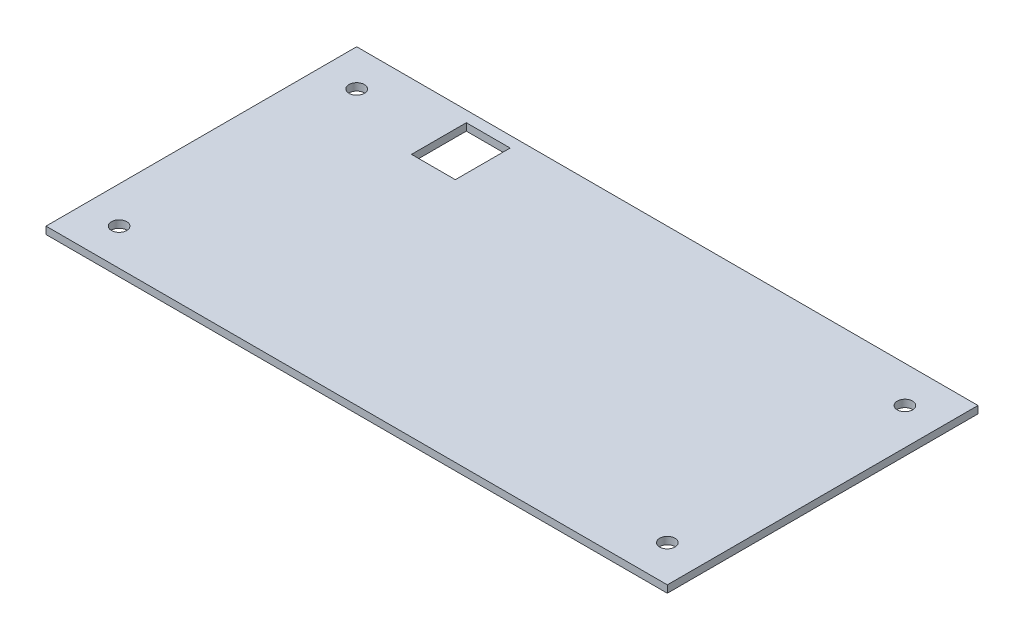
ISO-10303-21;
HEADER;
FILE_DESCRIPTION(('STEP AP214'),'2;1');
FILE_NAME('part.step','',(''),(''),'','','');
FILE_SCHEMA(('AUTOMOTIVE_DESIGN { 1 0 10303 214 1 1 1 1 }'));
ENDSEC;
DATA;
#1=APPLICATION_CONTEXT('core data for automotive mechanical design processes');
#2=APPLICATION_PROTOCOL_DEFINITION('international standard','automotive_design',2000,#1);
#3=PRODUCT_CONTEXT('',#1,'mechanical');
#4=PRODUCT('Part','Part','',(#3));
#5=PRODUCT_RELATED_PRODUCT_CATEGORY('part','',(#4));
#6=PRODUCT_DEFINITION_FORMATION('','',#4);
#7=PRODUCT_DEFINITION_CONTEXT('part definition',#1,'design');
#8=PRODUCT_DEFINITION('design','',#6,#7);
#9=PRODUCT_DEFINITION_SHAPE('','',#8);
#10=(LENGTH_UNIT() NAMED_UNIT(*) SI_UNIT(.MILLI.,.METRE.));
#11=(NAMED_UNIT(*) PLANE_ANGLE_UNIT() SI_UNIT($,.RADIAN.));
#12=(NAMED_UNIT(*) SI_UNIT($,.STERADIAN.) SOLID_ANGLE_UNIT());
#13=UNCERTAINTY_MEASURE_WITH_UNIT(LENGTH_MEASURE(1.E-05),#10,'distance_accuracy_value','');
#14=(GEOMETRIC_REPRESENTATION_CONTEXT(3) GLOBAL_UNCERTAINTY_ASSIGNED_CONTEXT((#13)) GLOBAL_UNIT_ASSIGNED_CONTEXT((#10,
#11,#12)) REPRESENTATION_CONTEXT('',''));
#15=CARTESIAN_POINT('',(0.,0.,0.));
#16=DIRECTION('',(0.,0.,1.));
#17=DIRECTION('',(1.,0.,0.));
#18=AXIS2_PLACEMENT_3D('',#15,#16,#17);
#19=CARTESIAN_POINT('',(-74.5991561181434,2.,-39.4514767932489));
#20=DIRECTION('',(1.,0.,0.));
#21=DIRECTION('',(0.,0.,-1.));
#22=AXIS2_PLACEMENT_3D('',#19,#20,#21);
#23=PLANE('',#22);
#24=DIRECTION('',(0.,0.,1.));
#25=VECTOR('',#24,1.);
#26=CARTESIAN_POINT('',(-74.5991561181434,0.,-39.4514767932489));
#27=LINE('',#26,#25);
#28=CARTESIAN_POINT('',(-74.5991561181434,0.,-39.4514767932489));
#29=VERTEX_POINT('',#28);
#30=CARTESIAN_POINT('',(-74.5991561181434,0.,45.5485232067511));
#31=VERTEX_POINT('',#30);
#32=EDGE_CURVE('E136',#29,#31,#27,.T.);
#33=ORIENTED_EDGE('',*,*,#32,.T.);
#34=DIRECTION('',(0.,-1.,0.));
#35=VECTOR('',#34,1.);
#36=CARTESIAN_POINT('',(-74.5991561181434,2.,45.5485232067511));
#37=LINE('',#36,#35);
#38=CARTESIAN_POINT('',(-74.5991561181434,2.,45.5485232067511));
#39=VERTEX_POINT('',#38);
#40=EDGE_CURVE('E11',#39,#31,#37,.T.);
#41=ORIENTED_EDGE('',*,*,#40,.F.);
#42=DIRECTION('',(0.,0.,1.));
#43=VECTOR('',#42,1.);
#44=CARTESIAN_POINT('',(-74.5991561181434,2.,-39.4514767932489));
#45=LINE('',#44,#43);
#46=CARTESIAN_POINT('',(-74.5991561181434,2.,-39.4514767932489));
#47=VERTEX_POINT('',#46);
#48=EDGE_CURVE('E145',#47,#39,#45,.T.);
#49=ORIENTED_EDGE('',*,*,#48,.F.);
#50=DIRECTION('',(0.,-1.,0.));
#51=VECTOR('',#50,1.);
#52=CARTESIAN_POINT('',(-74.5991561181434,2.,-39.4514767932489));
#53=LINE('',#52,#51);
#54=EDGE_CURVE('E152',#47,#29,#53,.T.);
#55=ORIENTED_EDGE('',*,*,#54,.T.);
#56=EDGE_LOOP('',(#33,#41,#49,#55));
#57=FACE_BOUND('',#56,.T.);
#58=ADVANCED_FACE('F39',(#57),#23,.F.);
#59=CARTESIAN_POINT('',(-74.5991561181434,2.,45.5485232067511));
#60=DIRECTION('',(0.,0.,-1.));
#61=DIRECTION('',(-1.,0.,0.));
#62=AXIS2_PLACEMENT_3D('',#59,#60,#61);
#63=PLANE('',#62);
#64=DIRECTION('',(1.,0.,0.));
#65=VECTOR('',#64,1.);
#66=CARTESIAN_POINT('',(-74.5991561181434,0.,45.5485232067511));
#67=LINE('',#66,#65);
#68=CARTESIAN_POINT('',(95.4008438818566,0.,45.5485232067511));
#69=VERTEX_POINT('',#68);
#70=EDGE_CURVE('E160',#31,#69,#67,.T.);
#71=ORIENTED_EDGE('',*,*,#70,.T.);
#72=DIRECTION('',(0.,-1.,0.));
#73=VECTOR('',#72,1.);
#74=CARTESIAN_POINT('',(95.4008438818566,2.,45.5485232067511));
#75=LINE('',#74,#73);
#76=CARTESIAN_POINT('',(95.4008438818566,2.,45.5485232067511));
#77=VERTEX_POINT('',#76);
#78=EDGE_CURVE('E46',#77,#69,#75,.T.);
#79=ORIENTED_EDGE('',*,*,#78,.F.);
#80=DIRECTION('',(1.,0.,0.));
#81=VECTOR('',#80,1.);
#82=CARTESIAN_POINT('',(-74.5991561181434,2.,45.5485232067511));
#83=LINE('',#82,#81);
#84=EDGE_CURVE('E150',#39,#77,#83,.T.);
#85=ORIENTED_EDGE('',*,*,#84,.F.);
#86=ORIENTED_EDGE('',*,*,#40,.T.);
#87=EDGE_LOOP('',(#71,#79,#85,#86));
#88=FACE_BOUND('',#87,.T.);
#89=ADVANCED_FACE('F183',(#88),#63,.F.);
#90=CARTESIAN_POINT('',(95.4008438818566,2.,-39.4514767932489));
#91=DIRECTION('',(-1.,0.,0.));
#92=DIRECTION('',(0.,0.,1.));
#93=AXIS2_PLACEMENT_3D('',#90,#91,#92);
#94=PLANE('',#93);
#95=DIRECTION('',(0.,0.,-1.));
#96=VECTOR('',#95,1.);
#97=CARTESIAN_POINT('',(95.4008438818566,0.,-39.4514767932489));
#98=LINE('',#97,#96);
#99=CARTESIAN_POINT('',(95.4008438818566,0.,-39.4514767932489));
#100=VERTEX_POINT('',#99);
#101=EDGE_CURVE('E157',#69,#100,#98,.T.);
#102=ORIENTED_EDGE('',*,*,#101,.T.);
#103=DIRECTION('',(0.,-1.,0.));
#104=VECTOR('',#103,1.);
#105=CARTESIAN_POINT('',(95.4008438818566,2.,-39.4514767932489));
#106=LINE('',#105,#104);
#107=CARTESIAN_POINT('',(95.4008438818566,2.,-39.4514767932489));
#108=VERTEX_POINT('',#107);
#109=EDGE_CURVE('E163',#108,#100,#106,.T.);
#110=ORIENTED_EDGE('',*,*,#109,.F.);
#111=DIRECTION('',(0.,0.,-1.));
#112=VECTOR('',#111,1.);
#113=CARTESIAN_POINT('',(95.4008438818566,2.,-39.4514767932489));
#114=LINE('',#113,#112);
#115=EDGE_CURVE('E147',#77,#108,#114,.T.);
#116=ORIENTED_EDGE('',*,*,#115,.F.);
#117=ORIENTED_EDGE('',*,*,#78,.T.);
#118=EDGE_LOOP('',(#102,#110,#116,#117));
#119=FACE_BOUND('',#118,.T.);
#120=ADVANCED_FACE('F171',(#119),#94,.F.);
#121=CARTESIAN_POINT('',(-74.5991561181434,2.,-39.4514767932489));
#122=DIRECTION('',(0.,0.,1.));
#123=DIRECTION('',(1.,0.,0.));
#124=AXIS2_PLACEMENT_3D('',#121,#122,#123);
#125=PLANE('',#124);
#126=DIRECTION('',(-1.,0.,0.));
#127=VECTOR('',#126,1.);
#128=CARTESIAN_POINT('',(-74.5991561181434,0.,-39.4514767932489));
#129=LINE('',#128,#127);
#130=EDGE_CURVE('E146',#100,#29,#129,.T.);
#131=ORIENTED_EDGE('',*,*,#130,.T.);
#132=ORIENTED_EDGE('',*,*,#54,.F.);
#133=DIRECTION('',(-1.,0.,0.));
#134=VECTOR('',#133,1.);
#135=CARTESIAN_POINT('',(-74.5991561181434,2.,-39.4514767932489));
#136=LINE('',#135,#134);
#137=EDGE_CURVE('E155',#108,#47,#136,.T.);
#138=ORIENTED_EDGE('',*,*,#137,.F.);
#139=ORIENTED_EDGE('',*,*,#109,.T.);
#140=EDGE_LOOP('',(#131,#132,#138,#139));
#141=FACE_BOUND('',#140,.T.);
#142=ADVANCED_FACE('F178',(#141),#125,.F.);
#143=CARTESIAN_POINT('',(0.,2.,0.));
#144=DIRECTION('',(0.,1.,0.));
#145=DIRECTION('',(0.,0.,1.));
#146=AXIS2_PLACEMENT_3D('',#143,#144,#145);
#147=PLANE('',#146);
#148=CARTESIAN_POINT('',(85.4008438818566,2.,-29.4514767932489));
#149=DIRECTION('',(0.,1.,0.));
#150=DIRECTION('',(0.,0.,1.));
#151=AXIS2_PLACEMENT_3D('',#148,#149,#150);
#152=CIRCLE('',#151,2.1);
#153=CARTESIAN_POINT('',(85.4008438818566,2.,-27.3514767932489));
#154=VERTEX_POINT('',#153);
#155=EDGE_CURVE('E243',#154,#154,#152,.T.);
#156=ORIENTED_EDGE('',*,*,#155,.F.);
#157=EDGE_LOOP('',(#156));
#158=FACE_BOUND('',#157,.T.);
#159=CARTESIAN_POINT('',(-64.5991561181434,2.,35.5485232067511));
#160=DIRECTION('',(0.,1.,0.));
#161=DIRECTION('',(0.,0.,1.));
#162=AXIS2_PLACEMENT_3D('',#159,#160,#161);
#163=CIRCLE('',#162,2.1);
#164=CARTESIAN_POINT('',(-64.5991561181434,2.,37.6485232067511));
#165=VERTEX_POINT('',#164);
#166=EDGE_CURVE('E238',#165,#165,#163,.T.);
#167=ORIENTED_EDGE('',*,*,#166,.F.);
#168=EDGE_LOOP('',(#167));
#169=FACE_BOUND('',#168,.T.);
#170=CARTESIAN_POINT('',(85.4008438818566,2.,35.5485232067511));
#171=DIRECTION('',(0.,1.,0.));
#172=DIRECTION('',(0.,0.,1.));
#173=AXIS2_PLACEMENT_3D('',#170,#171,#172);
#174=CIRCLE('',#173,2.1);
#175=CARTESIAN_POINT('',(85.4008438818566,2.,37.6485232067511));
#176=VERTEX_POINT('',#175);
#177=EDGE_CURVE('E231',#176,#176,#174,.T.);
#178=ORIENTED_EDGE('',*,*,#177,.F.);
#179=EDGE_LOOP('',(#178));
#180=FACE_BOUND('',#179,.T.);
#181=CARTESIAN_POINT('',(-64.5991561181435,2.,-29.4514767932489));
#182=DIRECTION('',(0.,1.,0.));
#183=DIRECTION('',(0.,0.,1.));
#184=AXIS2_PLACEMENT_3D('',#181,#182,#183);
#185=CIRCLE('',#184,2.1);
#186=CARTESIAN_POINT('',(-64.5991561181435,2.,-27.3514767932489));
#187=VERTEX_POINT('',#186);
#188=EDGE_CURVE('E130',#187,#187,#185,.T.);
#189=ORIENTED_EDGE('',*,*,#188,.F.);
#190=EDGE_LOOP('',(#189));
#191=FACE_BOUND('',#190,.T.);
#192=DIRECTION('',(-1.,0.,0.));
#193=VECTOR('',#192,1.);
#194=CARTESIAN_POINT('',(-41.5991561181434,2.,-36.4514767932489));
#195=LINE('',#194,#193);
#196=CARTESIAN_POINT('',(-29.5991561181434,2.,-36.4514767932489));
#197=VERTEX_POINT('',#196);
#198=CARTESIAN_POINT('',(-41.5991561181434,2.,-36.4514767932489));
#199=VERTEX_POINT('',#198);
#200=EDGE_CURVE('E52',#197,#199,#195,.T.);
#201=ORIENTED_EDGE('',*,*,#200,.F.);
#202=DIRECTION('',(0.,0.,-1.));
#203=VECTOR('',#202,1.);
#204=CARTESIAN_POINT('',(-29.5991561181434,2.,-36.4514767932489));
#205=LINE('',#204,#203);
#206=CARTESIAN_POINT('',(-29.5991561181434,2.,-21.4514767932489));
#207=VERTEX_POINT('',#206);
#208=EDGE_CURVE('E122',#207,#197,#205,.T.);
#209=ORIENTED_EDGE('',*,*,#208,.F.);
#210=DIRECTION('',(1.,0.,0.));
#211=VECTOR('',#210,1.);
#212=CARTESIAN_POINT('',(-41.5991561181434,2.,-21.4514767932489));
#213=LINE('',#212,#211);
#214=CARTESIAN_POINT('',(-41.5991561181434,2.,-21.4514767932489));
#215=VERTEX_POINT('',#214);
#216=EDGE_CURVE('E124',#215,#207,#213,.T.);
#217=ORIENTED_EDGE('',*,*,#216,.F.);
#218=DIRECTION('',(0.,0.,1.));
#219=VECTOR('',#218,1.);
#220=CARTESIAN_POINT('',(-41.5991561181434,2.,-36.4514767932489));
#221=LINE('',#220,#219);
#222=EDGE_CURVE('E134',#199,#215,#221,.T.);
#223=ORIENTED_EDGE('',*,*,#222,.F.);
#224=EDGE_LOOP('',(#201,#209,#217,#223));
#225=FACE_BOUND('',#224,.T.);
#226=ORIENTED_EDGE('',*,*,#48,.T.);
#227=ORIENTED_EDGE('',*,*,#84,.T.);
#228=ORIENTED_EDGE('',*,*,#115,.T.);
#229=ORIENTED_EDGE('',*,*,#137,.T.);
#230=EDGE_LOOP('',(#226,#227,#228,#229));
#231=FACE_BOUND('',#230,.T.);
#232=ADVANCED_FACE('F184',(#158,#169,#180,#191,#225,#231),#147,.T.);
#233=CARTESIAN_POINT('',(0.,0.,0.));
#234=DIRECTION('',(0.,1.,0.));
#235=DIRECTION('',(0.,0.,1.));
#236=AXIS2_PLACEMENT_3D('',#233,#234,#235);
#237=PLANE('',#236);
#238=CARTESIAN_POINT('',(85.4008438818566,0.,-29.4514767932489));
#239=DIRECTION('',(0.,1.,0.));
#240=DIRECTION('',(0.,0.,1.));
#241=AXIS2_PLACEMENT_3D('',#238,#239,#240);
#242=CIRCLE('',#241,2.1);
#243=CARTESIAN_POINT('',(85.4008438818566,0.,-27.3514767932489));
#244=VERTEX_POINT('',#243);
#245=EDGE_CURVE('E250',#244,#244,#242,.T.);
#246=ORIENTED_EDGE('',*,*,#245,.T.);
#247=EDGE_LOOP('',(#246));
#248=FACE_BOUND('',#247,.T.);
#249=CARTESIAN_POINT('',(-64.5991561181434,0.,35.5485232067511));
#250=DIRECTION('',(0.,1.,0.));
#251=DIRECTION('',(0.,0.,1.));
#252=AXIS2_PLACEMENT_3D('',#249,#250,#251);
#253=CIRCLE('',#252,2.1);
#254=CARTESIAN_POINT('',(-64.5991561181434,0.,37.6485232067511));
#255=VERTEX_POINT('',#254);
#256=EDGE_CURVE('E240',#255,#255,#253,.T.);
#257=ORIENTED_EDGE('',*,*,#256,.T.);
#258=EDGE_LOOP('',(#257));
#259=FACE_BOUND('',#258,.T.);
#260=CARTESIAN_POINT('',(85.4008438818566,0.,35.5485232067511));
#261=DIRECTION('',(0.,1.,0.));
#262=DIRECTION('',(0.,0.,1.));
#263=AXIS2_PLACEMENT_3D('',#260,#261,#262);
#264=CIRCLE('',#263,2.1);
#265=CARTESIAN_POINT('',(85.4008438818566,0.,37.6485232067511));
#266=VERTEX_POINT('',#265);
#267=EDGE_CURVE('E235',#266,#266,#264,.T.);
#268=ORIENTED_EDGE('',*,*,#267,.T.);
#269=EDGE_LOOP('',(#268));
#270=FACE_BOUND('',#269,.T.);
#271=CARTESIAN_POINT('',(-64.5991561181435,0.,-29.4514767932489));
#272=DIRECTION('',(0.,1.,0.));
#273=DIRECTION('',(0.,0.,1.));
#274=AXIS2_PLACEMENT_3D('',#271,#272,#273);
#275=CIRCLE('',#274,2.1);
#276=CARTESIAN_POINT('',(-64.5991561181435,0.,-27.3514767932489));
#277=VERTEX_POINT('',#276);
#278=EDGE_CURVE('E133',#277,#277,#275,.T.);
#279=ORIENTED_EDGE('',*,*,#278,.T.);
#280=EDGE_LOOP('',(#279));
#281=FACE_BOUND('',#280,.T.);
#282=DIRECTION('',(0.,0.,-1.));
#283=VECTOR('',#282,1.);
#284=CARTESIAN_POINT('',(-29.5991561181434,0.,-36.4514767932489));
#285=LINE('',#284,#283);
#286=CARTESIAN_POINT('',(-29.5991561181434,0.,-21.4514767932489));
#287=VERTEX_POINT('',#286);
#288=CARTESIAN_POINT('',(-29.5991561181434,0.,-36.4514767932489));
#289=VERTEX_POINT('',#288);
#290=EDGE_CURVE('E112',#287,#289,#285,.T.);
#291=ORIENTED_EDGE('',*,*,#290,.T.);
#292=DIRECTION('',(-1.,0.,0.));
#293=VECTOR('',#292,1.);
#294=CARTESIAN_POINT('',(-41.5991561181434,0.,-36.4514767932489));
#295=LINE('',#294,#293);
#296=CARTESIAN_POINT('',(-41.5991561181434,0.,-36.4514767932489));
#297=VERTEX_POINT('',#296);
#298=EDGE_CURVE('E104',#289,#297,#295,.T.);
#299=ORIENTED_EDGE('',*,*,#298,.T.);
#300=DIRECTION('',(0.,0.,1.));
#301=VECTOR('',#300,1.);
#302=CARTESIAN_POINT('',(-41.5991561181434,0.,-36.4514767932489));
#303=LINE('',#302,#301);
#304=CARTESIAN_POINT('',(-41.5991561181434,0.,-21.4514767932489));
#305=VERTEX_POINT('',#304);
#306=EDGE_CURVE('E111',#297,#305,#303,.T.);
#307=ORIENTED_EDGE('',*,*,#306,.T.);
#308=DIRECTION('',(1.,0.,0.));
#309=VECTOR('',#308,1.);
#310=CARTESIAN_POINT('',(-41.5991561181434,0.,-21.4514767932489));
#311=LINE('',#310,#309);
#312=EDGE_CURVE('E61',#305,#287,#311,.T.);
#313=ORIENTED_EDGE('',*,*,#312,.T.);
#314=EDGE_LOOP('',(#291,#299,#307,#313));
#315=FACE_BOUND('',#314,.T.);
#316=ORIENTED_EDGE('',*,*,#32,.F.);
#317=ORIENTED_EDGE('',*,*,#130,.F.);
#318=ORIENTED_EDGE('',*,*,#101,.F.);
#319=ORIENTED_EDGE('',*,*,#70,.F.);
#320=EDGE_LOOP('',(#316,#317,#318,#319));
#321=FACE_BOUND('',#320,.T.);
#322=ADVANCED_FACE('F119',(#248,#259,#270,#281,#315,#321),#237,.F.);
#323=CARTESIAN_POINT('',(-41.5991561181434,0.,-36.4514767932489));
#324=DIRECTION('',(0.,0.,-1.));
#325=DIRECTION('',(-1.,0.,0.));
#326=AXIS2_PLACEMENT_3D('',#323,#324,#325);
#327=PLANE('',#326);
#328=ORIENTED_EDGE('',*,*,#200,.T.);
#329=DIRECTION('',(0.,1.,0.));
#330=VECTOR('',#329,1.);
#331=CARTESIAN_POINT('',(-41.5991561181434,0.,-36.4514767932489));
#332=LINE('',#331,#330);
#333=EDGE_CURVE('E101',#297,#199,#332,.T.);
#334=ORIENTED_EDGE('',*,*,#333,.F.);
#335=ORIENTED_EDGE('',*,*,#298,.F.);
#336=DIRECTION('',(0.,1.,0.));
#337=VECTOR('',#336,1.);
#338=CARTESIAN_POINT('',(-29.5991561181434,0.,-36.4514767932489));
#339=LINE('',#338,#337);
#340=EDGE_CURVE('E138',#289,#197,#339,.T.);
#341=ORIENTED_EDGE('',*,*,#340,.T.);
#342=EDGE_LOOP('',(#328,#334,#335,#341));
#343=FACE_BOUND('',#342,.T.);
#344=ADVANCED_FACE('F103',(#343),#327,.F.);
#345=CARTESIAN_POINT('',(-29.5991561181434,0.,-36.4514767932489));
#346=DIRECTION('',(1.,0.,0.));
#347=DIRECTION('',(0.,0.,-1.));
#348=AXIS2_PLACEMENT_3D('',#345,#346,#347);
#349=PLANE('',#348);
#350=ORIENTED_EDGE('',*,*,#208,.T.);
#351=ORIENTED_EDGE('',*,*,#340,.F.);
#352=ORIENTED_EDGE('',*,*,#290,.F.);
#353=DIRECTION('',(0.,1.,0.));
#354=VECTOR('',#353,1.);
#355=CARTESIAN_POINT('',(-29.5991561181434,0.,-21.4514767932489));
#356=LINE('',#355,#354);
#357=EDGE_CURVE('E143',#287,#207,#356,.T.);
#358=ORIENTED_EDGE('',*,*,#357,.T.);
#359=EDGE_LOOP('',(#350,#351,#352,#358));
#360=FACE_BOUND('',#359,.T.);
#361=ADVANCED_FACE('F201',(#360),#349,.F.);
#362=CARTESIAN_POINT('',(-41.5991561181434,0.,-21.4514767932489));
#363=DIRECTION('',(0.,0.,1.));
#364=DIRECTION('',(1.,0.,0.));
#365=AXIS2_PLACEMENT_3D('',#362,#363,#364);
#366=PLANE('',#365);
#367=ORIENTED_EDGE('',*,*,#216,.T.);
#368=ORIENTED_EDGE('',*,*,#357,.F.);
#369=ORIENTED_EDGE('',*,*,#312,.F.);
#370=DIRECTION('',(0.,1.,0.));
#371=VECTOR('',#370,1.);
#372=CARTESIAN_POINT('',(-41.5991561181434,0.,-21.4514767932489));
#373=LINE('',#372,#371);
#374=EDGE_CURVE('E109',#305,#215,#373,.T.);
#375=ORIENTED_EDGE('',*,*,#374,.T.);
#376=EDGE_LOOP('',(#367,#368,#369,#375));
#377=FACE_BOUND('',#376,.T.);
#378=ADVANCED_FACE('F210',(#377),#366,.F.);
#379=CARTESIAN_POINT('',(-41.5991561181434,0.,-36.4514767932489));
#380=DIRECTION('',(-1.,0.,0.));
#381=DIRECTION('',(0.,0.,1.));
#382=AXIS2_PLACEMENT_3D('',#379,#380,#381);
#383=PLANE('',#382);
#384=ORIENTED_EDGE('',*,*,#222,.T.);
#385=ORIENTED_EDGE('',*,*,#374,.F.);
#386=ORIENTED_EDGE('',*,*,#306,.F.);
#387=ORIENTED_EDGE('',*,*,#333,.T.);
#388=EDGE_LOOP('',(#384,#385,#386,#387));
#389=FACE_BOUND('',#388,.T.);
#390=ADVANCED_FACE('F113',(#389),#383,.F.);
#391=CARTESIAN_POINT('',(-64.5991561181435,0.,-29.4514767932489));
#392=DIRECTION('',(0.,1.,0.));
#393=DIRECTION('',(0.,0.,1.));
#394=AXIS2_PLACEMENT_3D('',#391,#392,#393);
#395=CYLINDRICAL_SURFACE('',#394,2.1);
#396=ORIENTED_EDGE('',*,*,#278,.F.);
#397=EDGE_LOOP('',(#396));
#398=FACE_BOUND('',#397,.T.);
#399=ORIENTED_EDGE('',*,*,#188,.T.);
#400=EDGE_LOOP('',(#399));
#401=FACE_BOUND('',#400,.T.);
#402=ADVANCED_FACE('F206',(#398,#401),#395,.F.);
#403=CARTESIAN_POINT('',(85.4008438818566,0.,35.5485232067511));
#404=DIRECTION('',(0.,1.,0.));
#405=DIRECTION('',(0.,0.,1.));
#406=AXIS2_PLACEMENT_3D('',#403,#404,#405);
#407=CYLINDRICAL_SURFACE('',#406,2.1);
#408=ORIENTED_EDGE('',*,*,#267,.F.);
#409=EDGE_LOOP('',(#408));
#410=FACE_BOUND('',#409,.T.);
#411=ORIENTED_EDGE('',*,*,#177,.T.);
#412=EDGE_LOOP('',(#411));
#413=FACE_BOUND('',#412,.T.);
#414=ADVANCED_FACE('F214',(#410,#413),#407,.F.);
#415=CARTESIAN_POINT('',(-64.5991561181434,0.,35.5485232067511));
#416=DIRECTION('',(0.,1.,0.));
#417=DIRECTION('',(0.,0.,1.));
#418=AXIS2_PLACEMENT_3D('',#415,#416,#417);
#419=CYLINDRICAL_SURFACE('',#418,2.1);
#420=ORIENTED_EDGE('',*,*,#256,.F.);
#421=EDGE_LOOP('',(#420));
#422=FACE_BOUND('',#421,.T.);
#423=ORIENTED_EDGE('',*,*,#166,.T.);
#424=EDGE_LOOP('',(#423));
#425=FACE_BOUND('',#424,.T.);
#426=ADVANCED_FACE('F220',(#422,#425),#419,.F.);
#427=CARTESIAN_POINT('',(85.4008438818566,0.,-29.4514767932489));
#428=DIRECTION('',(0.,1.,0.));
#429=DIRECTION('',(0.,0.,1.));
#430=AXIS2_PLACEMENT_3D('',#427,#428,#429);
#431=CYLINDRICAL_SURFACE('',#430,2.1);
#432=ORIENTED_EDGE('',*,*,#245,.F.);
#433=EDGE_LOOP('',(#432));
#434=FACE_BOUND('',#433,.T.);
#435=ORIENTED_EDGE('',*,*,#155,.T.);
#436=EDGE_LOOP('',(#435));
#437=FACE_BOUND('',#436,.T.);
#438=ADVANCED_FACE('F219',(#434,#437),#431,.F.);
#439=CLOSED_SHELL('',(#58,#89,#120,#142,#232,#322,#344,#361,#378,#390,#402,#414,#426,#438));
#440=MANIFOLD_SOLID_BREP('B2',#439);
#441=ADVANCED_BREP_SHAPE_REPRESENTATION('',(#18,#440),#14);
#442=SHAPE_DEFINITION_REPRESENTATION(#9,#441);
ENDSEC;
END-ISO-10303-21;
